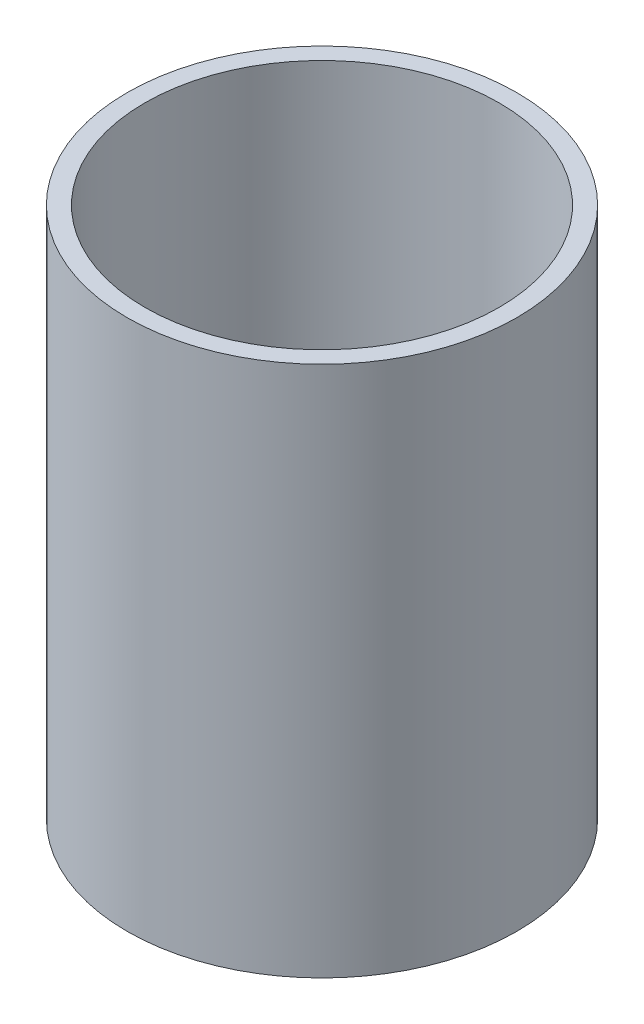
ISO-10303-21;
HEADER;
FILE_DESCRIPTION(('STEP AP214'),'2;1');
FILE_NAME('part.step','',(''),(''),'','','');
FILE_SCHEMA(('AUTOMOTIVE_DESIGN { 1 0 10303 214 1 1 1 1 }'));
ENDSEC;
DATA;
#1=APPLICATION_CONTEXT('core data for automotive mechanical design processes');
#2=APPLICATION_PROTOCOL_DEFINITION('international standard','automotive_design',2000,#1);
#3=PRODUCT_CONTEXT('',#1,'mechanical');
#4=PRODUCT('Part','Part','',(#3));
#5=PRODUCT_RELATED_PRODUCT_CATEGORY('part','',(#4));
#6=PRODUCT_DEFINITION_FORMATION('','',#4);
#7=PRODUCT_DEFINITION_CONTEXT('part definition',#1,'design');
#8=PRODUCT_DEFINITION('design','',#6,#7);
#9=PRODUCT_DEFINITION_SHAPE('','',#8);
#10=(LENGTH_UNIT() NAMED_UNIT(*) SI_UNIT(.MILLI.,.METRE.));
#11=(NAMED_UNIT(*) PLANE_ANGLE_UNIT() SI_UNIT($,.RADIAN.));
#12=(NAMED_UNIT(*) SI_UNIT($,.STERADIAN.) SOLID_ANGLE_UNIT());
#13=UNCERTAINTY_MEASURE_WITH_UNIT(LENGTH_MEASURE(1.E-05),#10,'distance_accuracy_value','');
#14=(GEOMETRIC_REPRESENTATION_CONTEXT(3) GLOBAL_UNCERTAINTY_ASSIGNED_CONTEXT((#13)) GLOBAL_UNIT_ASSIGNED_CONTEXT((#10,
#11,#12)) REPRESENTATION_CONTEXT('',''));
#15=CARTESIAN_POINT('',(0.,0.,0.));
#16=DIRECTION('',(0.,0.,1.));
#17=DIRECTION('',(1.,0.,0.));
#18=AXIS2_PLACEMENT_3D('',#15,#16,#17);
#19=CARTESIAN_POINT('',(0.,150.,0.));
#20=DIRECTION('',(0.,-1.,0.));
#21=DIRECTION('',(0.,0.,-1.));
#22=AXIS2_PLACEMENT_3D('',#19,#20,#21);
#23=CYLINDRICAL_SURFACE('',#22,55.);
#24=CARTESIAN_POINT('',(0.,150.,0.));
#25=DIRECTION('',(0.,1.,0.));
#26=DIRECTION('',(0.,0.,1.));
#27=AXIS2_PLACEMENT_3D('',#24,#25,#26);
#28=CIRCLE('',#27,55.);
#29=CARTESIAN_POINT('',(0.,150.,55.));
#30=VERTEX_POINT('',#29);
#31=EDGE_CURVE('E10',#30,#30,#28,.T.);
#32=ORIENTED_EDGE('',*,*,#31,.F.);
#33=EDGE_LOOP('',(#32));
#34=FACE_BOUND('',#33,.T.);
#35=CARTESIAN_POINT('',(0.,0.,0.));
#36=DIRECTION('',(0.,1.,0.));
#37=DIRECTION('',(0.,0.,1.));
#38=AXIS2_PLACEMENT_3D('',#35,#36,#37);
#39=CIRCLE('',#38,55.);
#40=CARTESIAN_POINT('',(0.,0.,55.));
#41=VERTEX_POINT('',#40);
#42=EDGE_CURVE('E35',#41,#41,#39,.T.);
#43=ORIENTED_EDGE('',*,*,#42,.T.);
#44=EDGE_LOOP('',(#43));
#45=FACE_BOUND('',#44,.T.);
#46=ADVANCED_FACE('F28',(#34,#45),#23,.T.);
#47=CARTESIAN_POINT('',(0.,150.,0.));
#48=DIRECTION('',(0.,1.,0.));
#49=DIRECTION('',(0.,0.,1.));
#50=AXIS2_PLACEMENT_3D('',#47,#48,#49);
#51=PLANE('',#50);
#52=CARTESIAN_POINT('',(0.,150.,0.));
#53=DIRECTION('',(0.,1.,0.));
#54=DIRECTION('',(0.,0.,1.));
#55=AXIS2_PLACEMENT_3D('',#52,#53,#54);
#56=CIRCLE('',#55,50.);
#57=CARTESIAN_POINT('',(0.,150.,50.));
#58=VERTEX_POINT('',#57);
#59=EDGE_CURVE('E42',#58,#58,#56,.T.);
#60=ORIENTED_EDGE('',*,*,#59,.F.);
#61=EDGE_LOOP('',(#60));
#62=FACE_BOUND('',#61,.T.);
#63=ORIENTED_EDGE('',*,*,#31,.T.);
#64=EDGE_LOOP('',(#63));
#65=FACE_BOUND('',#64,.T.);
#66=ADVANCED_FACE('F69',(#62,#65),#51,.T.);
#67=CARTESIAN_POINT('',(0.,0.,0.));
#68=DIRECTION('',(0.,1.,0.));
#69=DIRECTION('',(0.,0.,1.));
#70=AXIS2_PLACEMENT_3D('',#67,#68,#69);
#71=PLANE('',#70);
#72=CARTESIAN_POINT('',(0.,0.,0.));
#73=DIRECTION('',(0.,-1.,0.));
#74=DIRECTION('',(0.,0.,-1.));
#75=AXIS2_PLACEMENT_3D('',#72,#73,#74);
#76=CIRCLE('',#75,13.75);
#77=CARTESIAN_POINT('',(0.,0.,-13.75));
#78=VERTEX_POINT('',#77);
#79=EDGE_CURVE('E47',#78,#78,#76,.T.);
#80=ORIENTED_EDGE('',*,*,#79,.F.);
#81=EDGE_LOOP('',(#80));
#82=FACE_BOUND('',#81,.T.);
#83=ORIENTED_EDGE('',*,*,#42,.F.);
#84=EDGE_LOOP('',(#83));
#85=FACE_BOUND('',#84,.T.);
#86=ADVANCED_FACE('F65',(#82,#85),#71,.F.);
#87=CARTESIAN_POINT('',(0.,5.,0.));
#88=DIRECTION('',(0.,1.,0.));
#89=DIRECTION('',(0.,0.,1.));
#90=AXIS2_PLACEMENT_3D('',#87,#88,#89);
#91=CYLINDRICAL_SURFACE('',#90,50.);
#92=CARTESIAN_POINT('',(0.,5.,0.));
#93=DIRECTION('',(0.,1.,0.));
#94=DIRECTION('',(0.,0.,1.));
#95=AXIS2_PLACEMENT_3D('',#92,#93,#94);
#96=CIRCLE('',#95,50.);
#97=CARTESIAN_POINT('',(0.,5.,50.));
#98=VERTEX_POINT('',#97);
#99=EDGE_CURVE('E40',#98,#98,#96,.T.);
#100=ORIENTED_EDGE('',*,*,#99,.F.);
#101=EDGE_LOOP('',(#100));
#102=FACE_BOUND('',#101,.T.);
#103=ORIENTED_EDGE('',*,*,#59,.T.);
#104=EDGE_LOOP('',(#103));
#105=FACE_BOUND('',#104,.T.);
#106=ADVANCED_FACE('F59',(#102,#105),#91,.F.);
#107=CARTESIAN_POINT('',(0.,5.,0.));
#108=DIRECTION('',(0.,1.,0.));
#109=DIRECTION('',(0.,0.,1.));
#110=AXIS2_PLACEMENT_3D('',#107,#108,#109);
#111=PLANE('',#110);
#112=CARTESIAN_POINT('',(0.,5.,0.));
#113=DIRECTION('',(0.,1.,0.));
#114=DIRECTION('',(0.,0.,1.));
#115=AXIS2_PLACEMENT_3D('',#112,#113,#114);
#116=CIRCLE('',#115,13.75);
#117=CARTESIAN_POINT('',(0.,5.,13.75));
#118=VERTEX_POINT('',#117);
#119=EDGE_CURVE('E31',#118,#118,#116,.T.);
#120=ORIENTED_EDGE('',*,*,#119,.F.);
#121=EDGE_LOOP('',(#120));
#122=FACE_BOUND('',#121,.T.);
#123=ORIENTED_EDGE('',*,*,#99,.T.);
#124=EDGE_LOOP('',(#123));
#125=FACE_BOUND('',#124,.T.);
#126=ADVANCED_FACE('F56',(#122,#125),#111,.T.);
#127=CARTESIAN_POINT('',(0.,150.,0.));
#128=DIRECTION('',(0.,-1.,0.));
#129=DIRECTION('',(0.,0.,-1.));
#130=AXIS2_PLACEMENT_3D('',#127,#128,#129);
#131=CYLINDRICAL_SURFACE('',#130,13.75);
#132=ORIENTED_EDGE('',*,*,#119,.T.);
#133=EDGE_LOOP('',(#132));
#134=FACE_BOUND('',#133,.T.);
#135=ORIENTED_EDGE('',*,*,#79,.T.);
#136=EDGE_LOOP('',(#135));
#137=FACE_BOUND('',#136,.T.);
#138=ADVANCED_FACE('F54',(#134,#137),#131,.F.);
#139=CLOSED_SHELL('',(#46,#66,#86,#106,#126,#138));
#140=MANIFOLD_SOLID_BREP('B2',#139);
#141=ADVANCED_BREP_SHAPE_REPRESENTATION('',(#18,#140),#14);
#142=SHAPE_DEFINITION_REPRESENTATION(#9,#141);
ENDSEC;
END-ISO-10303-21;
